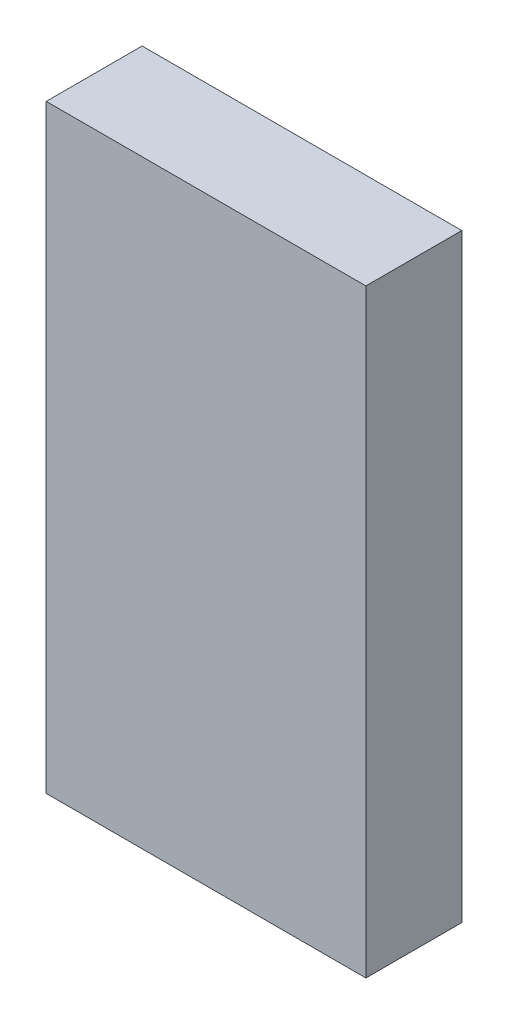
ISO-10303-21;
HEADER;
FILE_DESCRIPTION(('STEP AP214'),'2;1');
FILE_NAME('part.step','',(''),(''),'','','');
FILE_SCHEMA(('AUTOMOTIVE_DESIGN { 1 0 10303 214 1 1 1 1 }'));
ENDSEC;
DATA;
#1=APPLICATION_CONTEXT('core data for automotive mechanical design processes');
#2=APPLICATION_PROTOCOL_DEFINITION('international standard','automotive_design',2000,#1);
#3=PRODUCT_CONTEXT('',#1,'mechanical');
#4=PRODUCT('Part','Part','',(#3));
#5=PRODUCT_RELATED_PRODUCT_CATEGORY('part','',(#4));
#6=PRODUCT_DEFINITION_FORMATION('','',#4);
#7=PRODUCT_DEFINITION_CONTEXT('part definition',#1,'design');
#8=PRODUCT_DEFINITION('design','',#6,#7);
#9=PRODUCT_DEFINITION_SHAPE('','',#8);
#10=(LENGTH_UNIT() NAMED_UNIT(*) SI_UNIT(.MILLI.,.METRE.));
#11=(NAMED_UNIT(*) PLANE_ANGLE_UNIT() SI_UNIT($,.RADIAN.));
#12=(NAMED_UNIT(*) SI_UNIT($,.STERADIAN.) SOLID_ANGLE_UNIT());
#13=UNCERTAINTY_MEASURE_WITH_UNIT(LENGTH_MEASURE(1.E-05),#10,'distance_accuracy_value','');
#14=(GEOMETRIC_REPRESENTATION_CONTEXT(3) GLOBAL_UNCERTAINTY_ASSIGNED_CONTEXT((#13)) GLOBAL_UNIT_ASSIGNED_CONTEXT((#10,
#11,#12)) REPRESENTATION_CONTEXT('',''));
#15=CARTESIAN_POINT('',(0.,0.,0.));
#16=DIRECTION('',(0.,0.,1.));
#17=DIRECTION('',(1.,0.,0.));
#18=AXIS2_PLACEMENT_3D('',#15,#16,#17);
#19=CARTESIAN_POINT('',(5.,9.375,-1.5));
#20=DIRECTION('',(-1.,0.,0.));
#21=DIRECTION('',(0.,0.,1.));
#22=AXIS2_PLACEMENT_3D('',#19,#20,#21);
#23=PLANE('',#22);
#24=DIRECTION('',(0.,0.,-1.));
#25=VECTOR('',#24,1.);
#26=CARTESIAN_POINT('',(5.,-9.375,-1.5));
#27=LINE('',#26,#25);
#28=CARTESIAN_POINT('',(5.,-9.375,1.5));
#29=VERTEX_POINT('',#28);
#30=CARTESIAN_POINT('',(5.,-9.375,-1.5));
#31=VERTEX_POINT('',#30);
#32=EDGE_CURVE('E106',#29,#31,#27,.T.);
#33=ORIENTED_EDGE('',*,*,#32,.T.);
#34=DIRECTION('',(0.,-1.,0.));
#35=VECTOR('',#34,1.);
#36=CARTESIAN_POINT('',(5.,9.375,-1.5));
#37=LINE('',#36,#35);
#38=CARTESIAN_POINT('',(5.,9.375,-1.5));
#39=VERTEX_POINT('',#38);
#40=EDGE_CURVE('E11',#39,#31,#37,.T.);
#41=ORIENTED_EDGE('',*,*,#40,.F.);
#42=DIRECTION('',(0.,0.,-1.));
#43=VECTOR('',#42,1.);
#44=CARTESIAN_POINT('',(5.,9.375,-1.5));
#45=LINE('',#44,#43);
#46=CARTESIAN_POINT('',(5.,9.375,1.5));
#47=VERTEX_POINT('',#46);
#48=EDGE_CURVE('E90',#47,#39,#45,.T.);
#49=ORIENTED_EDGE('',*,*,#48,.F.);
#50=DIRECTION('',(0.,-1.,0.));
#51=VECTOR('',#50,1.);
#52=CARTESIAN_POINT('',(5.,9.375,1.5));
#53=LINE('',#52,#51);
#54=EDGE_CURVE('E102',#47,#29,#53,.T.);
#55=ORIENTED_EDGE('',*,*,#54,.T.);
#56=EDGE_LOOP('',(#33,#41,#49,#55));
#57=FACE_BOUND('',#56,.T.);
#58=ADVANCED_FACE('F38',(#57),#23,.F.);
#59=CARTESIAN_POINT('',(-5.,9.375,-1.5));
#60=DIRECTION('',(0.,0.,1.));
#61=DIRECTION('',(1.,0.,0.));
#62=AXIS2_PLACEMENT_3D('',#59,#60,#61);
#63=PLANE('',#62);
#64=DIRECTION('',(-1.,0.,0.));
#65=VECTOR('',#64,1.);
#66=CARTESIAN_POINT('',(-5.,-9.375,-1.5));
#67=LINE('',#66,#65);
#68=CARTESIAN_POINT('',(-5.,-9.375,-1.5));
#69=VERTEX_POINT('',#68);
#70=EDGE_CURVE('E95',#31,#69,#67,.T.);
#71=ORIENTED_EDGE('',*,*,#70,.T.);
#72=DIRECTION('',(0.,-1.,0.));
#73=VECTOR('',#72,1.);
#74=CARTESIAN_POINT('',(-5.,9.375,-1.5));
#75=LINE('',#74,#73);
#76=CARTESIAN_POINT('',(-5.,9.375,-1.5));
#77=VERTEX_POINT('',#76);
#78=EDGE_CURVE('E47',#77,#69,#75,.T.);
#79=ORIENTED_EDGE('',*,*,#78,.F.);
#80=DIRECTION('',(-1.,0.,0.));
#81=VECTOR('',#80,1.);
#82=CARTESIAN_POINT('',(-5.,9.375,-1.5));
#83=LINE('',#82,#81);
#84=EDGE_CURVE('E85',#39,#77,#83,.T.);
#85=ORIENTED_EDGE('',*,*,#84,.F.);
#86=ORIENTED_EDGE('',*,*,#40,.T.);
#87=EDGE_LOOP('',(#71,#79,#85,#86));
#88=FACE_BOUND('',#87,.T.);
#89=ADVANCED_FACE('F94',(#88),#63,.F.);
#90=CARTESIAN_POINT('',(-5.,9.375,-1.5));
#91=DIRECTION('',(1.,0.,0.));
#92=DIRECTION('',(0.,0.,-1.));
#93=AXIS2_PLACEMENT_3D('',#90,#91,#92);
#94=PLANE('',#93);
#95=DIRECTION('',(0.,0.,1.));
#96=VECTOR('',#95,1.);
#97=CARTESIAN_POINT('',(-5.,-9.375,-1.5));
#98=LINE('',#97,#96);
#99=CARTESIAN_POINT('',(-5.,-9.375,1.5));
#100=VERTEX_POINT('',#99);
#101=EDGE_CURVE('E72',#69,#100,#98,.T.);
#102=ORIENTED_EDGE('',*,*,#101,.T.);
#103=DIRECTION('',(0.,-1.,0.));
#104=VECTOR('',#103,1.);
#105=CARTESIAN_POINT('',(-5.,9.375,1.5));
#106=LINE('',#105,#104);
#107=CARTESIAN_POINT('',(-5.,9.375,1.5));
#108=VERTEX_POINT('',#107);
#109=EDGE_CURVE('E97',#108,#100,#106,.T.);
#110=ORIENTED_EDGE('',*,*,#109,.F.);
#111=DIRECTION('',(0.,0.,1.));
#112=VECTOR('',#111,1.);
#113=CARTESIAN_POINT('',(-5.,9.375,-1.5));
#114=LINE('',#113,#112);
#115=EDGE_CURVE('E88',#77,#108,#114,.T.);
#116=ORIENTED_EDGE('',*,*,#115,.F.);
#117=ORIENTED_EDGE('',*,*,#78,.T.);
#118=EDGE_LOOP('',(#102,#110,#116,#117));
#119=FACE_BOUND('',#118,.T.);
#120=ADVANCED_FACE('F98',(#119),#94,.F.);
#121=CARTESIAN_POINT('',(-5.,9.375,1.5));
#122=DIRECTION('',(0.,0.,-1.));
#123=DIRECTION('',(-1.,0.,0.));
#124=AXIS2_PLACEMENT_3D('',#121,#122,#123);
#125=PLANE('',#124);
#126=DIRECTION('',(1.,0.,0.));
#127=VECTOR('',#126,1.);
#128=CARTESIAN_POINT('',(-5.,-9.375,1.5));
#129=LINE('',#128,#127);
#130=EDGE_CURVE('E78',#100,#29,#129,.T.);
#131=ORIENTED_EDGE('',*,*,#130,.T.);
#132=ORIENTED_EDGE('',*,*,#54,.F.);
#133=DIRECTION('',(1.,0.,0.));
#134=VECTOR('',#133,1.);
#135=CARTESIAN_POINT('',(-5.,9.375,1.5));
#136=LINE('',#135,#134);
#137=EDGE_CURVE('E55',#108,#47,#136,.T.);
#138=ORIENTED_EDGE('',*,*,#137,.F.);
#139=ORIENTED_EDGE('',*,*,#109,.T.);
#140=EDGE_LOOP('',(#131,#132,#138,#139));
#141=FACE_BOUND('',#140,.T.);
#142=ADVANCED_FACE('F119',(#141),#125,.F.);
#143=CARTESIAN_POINT('',(0.,9.375,0.));
#144=DIRECTION('',(0.,1.,0.));
#145=DIRECTION('',(0.,0.,1.));
#146=AXIS2_PLACEMENT_3D('',#143,#144,#145);
#147=PLANE('',#146);
#148=ORIENTED_EDGE('',*,*,#48,.T.);
#149=ORIENTED_EDGE('',*,*,#84,.T.);
#150=ORIENTED_EDGE('',*,*,#115,.T.);
#151=ORIENTED_EDGE('',*,*,#137,.T.);
#152=EDGE_LOOP('',(#148,#149,#150,#151));
#153=FACE_BOUND('',#152,.T.);
#154=ADVANCED_FACE('F86',(#153),#147,.T.);
#155=CARTESIAN_POINT('',(0.,-9.375,0.));
#156=DIRECTION('',(0.,1.,0.));
#157=DIRECTION('',(0.,0.,1.));
#158=AXIS2_PLACEMENT_3D('',#155,#156,#157);
#159=PLANE('',#158);
#160=ORIENTED_EDGE('',*,*,#32,.F.);
#161=ORIENTED_EDGE('',*,*,#130,.F.);
#162=ORIENTED_EDGE('',*,*,#101,.F.);
#163=ORIENTED_EDGE('',*,*,#70,.F.);
#164=EDGE_LOOP('',(#160,#161,#162,#163));
#165=FACE_BOUND('',#164,.T.);
#166=ADVANCED_FACE('F122',(#165),#159,.F.);
#167=CLOSED_SHELL('',(#58,#89,#120,#142,#154,#166));
#168=MANIFOLD_SOLID_BREP('B2',#167);
#169=ADVANCED_BREP_SHAPE_REPRESENTATION('',(#18,#168),#14);
#170=SHAPE_DEFINITION_REPRESENTATION(#9,#169);
ENDSEC;
END-ISO-10303-21;
